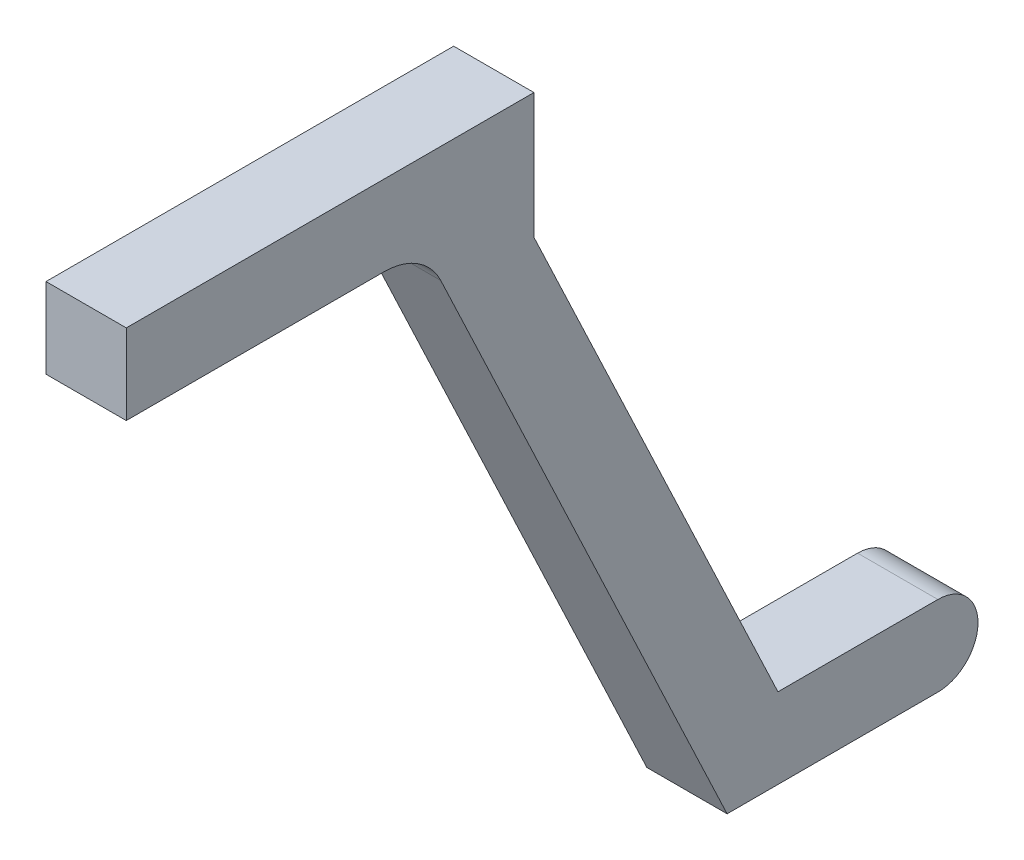
ISO-10303-21;
HEADER;
FILE_DESCRIPTION(('STEP AP214'),'2;1');
FILE_NAME('part.step','',(''),(''),'','','');
FILE_SCHEMA(('AUTOMOTIVE_DESIGN { 1 0 10303 214 1 1 1 1 }'));
ENDSEC;
DATA;
#1=APPLICATION_CONTEXT('core data for automotive mechanical design processes');
#2=APPLICATION_PROTOCOL_DEFINITION('international standard','automotive_design',2000,#1);
#3=PRODUCT_CONTEXT('',#1,'mechanical');
#4=PRODUCT('Part','Part','',(#3));
#5=PRODUCT_RELATED_PRODUCT_CATEGORY('part','',(#4));
#6=PRODUCT_DEFINITION_FORMATION('','',#4);
#7=PRODUCT_DEFINITION_CONTEXT('part definition',#1,'design');
#8=PRODUCT_DEFINITION('design','',#6,#7);
#9=PRODUCT_DEFINITION_SHAPE('','',#8);
#10=(LENGTH_UNIT() NAMED_UNIT(*) SI_UNIT(.MILLI.,.METRE.));
#11=(NAMED_UNIT(*) PLANE_ANGLE_UNIT() SI_UNIT($,.RADIAN.));
#12=(NAMED_UNIT(*) SI_UNIT($,.STERADIAN.) SOLID_ANGLE_UNIT());
#13=UNCERTAINTY_MEASURE_WITH_UNIT(LENGTH_MEASURE(1.E-05),#10,'distance_accuracy_value','');
#14=(GEOMETRIC_REPRESENTATION_CONTEXT(3) GLOBAL_UNCERTAINTY_ASSIGNED_CONTEXT((#13)) GLOBAL_UNIT_ASSIGNED_CONTEXT((#10,
#11,#12)) REPRESENTATION_CONTEXT('',''));
#15=CARTESIAN_POINT('',(0.,0.,0.));
#16=DIRECTION('',(0.,0.,1.));
#17=DIRECTION('',(1.,0.,0.));
#18=AXIS2_PLACEMENT_3D('',#15,#16,#17);
#19=CARTESIAN_POINT('',(1.18,0.,0.));
#20=DIRECTION('',(1.,0.,0.));
#21=DIRECTION('',(0.,1.,0.));
#22=AXIS2_PLACEMENT_3D('',#19,#20,#21);
#23=PLANE('',#22);
#24=DIRECTION('',(0.,0.,1.));
#25=VECTOR('',#24,1.);
#26=CARTESIAN_POINT('',(1.18,1.82,-6.905));
#27=LINE('',#26,#25);
#28=CARTESIAN_POINT('',(1.18,1.82,-6.905));
#29=VERTEX_POINT('',#28);
#30=CARTESIAN_POINT('',(1.18,1.82,-3.655));
#31=VERTEX_POINT('',#30);
#32=EDGE_CURVE('E151',#29,#31,#27,.T.);
#33=ORIENTED_EDGE('',*,*,#32,.F.);
#34=DIRECTION('',(0.,1.,0.));
#35=VECTOR('',#34,1.);
#36=CARTESIAN_POINT('',(1.18,0.82,-6.905));
#37=LINE('',#36,#35);
#38=CARTESIAN_POINT('',(1.18,0.82,-6.905));
#39=VERTEX_POINT('',#38);
#40=EDGE_CURVE('E11',#39,#29,#37,.T.);
#41=ORIENTED_EDGE('',*,*,#40,.F.);
#42=DIRECTION('',(0.,0.903880757165651,0.427784498112835));
#43=VECTOR('',#42,1.);
#44=CARTESIAN_POINT('',(1.18,-3.29,-8.850161763103));
#45=LINE('',#44,#43);
#46=CARTESIAN_POINT('',(1.18,-3.29,-8.850161763103));
#47=VERTEX_POINT('',#46);
#48=EDGE_CURVE('E44',#47,#39,#45,.T.);
#49=ORIENTED_EDGE('',*,*,#48,.F.);
#50=DIRECTION('',(0.,0.,1.));
#51=VECTOR('',#50,1.);
#52=CARTESIAN_POINT('',(1.18,-3.29,-10.125));
#53=LINE('',#52,#51);
#54=CARTESIAN_POINT('',(1.18,-3.29,-10.125));
#55=VERTEX_POINT('',#54);
#56=EDGE_CURVE('E183',#55,#47,#53,.T.);
#57=ORIENTED_EDGE('',*,*,#56,.F.);
#58=CARTESIAN_POINT('',(1.18,-3.61,-10.125));
#59=DIRECTION('',(1.,0.,0.));
#60=DIRECTION('',(0.,-1.,0.));
#61=AXIS2_PLACEMENT_3D('',#58,#59,#60);
#62=CIRCLE('',#61,0.32);
#63=CARTESIAN_POINT('',(1.18,-3.93,-10.125));
#64=VERTEX_POINT('',#63);
#65=EDGE_CURVE('E161',#64,#55,#62,.T.);
#66=ORIENTED_EDGE('',*,*,#65,.F.);
#67=DIRECTION('',(0.,0.,-1.));
#68=VECTOR('',#67,1.);
#69=CARTESIAN_POINT('',(1.18,-3.93,-8.445));
#70=LINE('',#69,#68);
#71=CARTESIAN_POINT('',(1.18,-3.93,-8.445));
#72=VERTEX_POINT('',#71);
#73=EDGE_CURVE('E173',#72,#64,#70,.T.);
#74=ORIENTED_EDGE('',*,*,#73,.F.);
#75=DIRECTION('',(0.,-0.903880757165651,-0.427784498112835));
#76=VECTOR('',#75,1.);
#77=CARTESIAN_POINT('',(1.18,0.893892249056,-6.161970619905));
#78=LINE('',#77,#76);
#79=CARTESIAN_POINT('',(1.18,0.893892249056,-6.161970619905));
#80=VERTEX_POINT('',#79);
#81=EDGE_CURVE('E124',#80,#72,#78,.T.);
#82=ORIENTED_EDGE('',*,*,#81,.F.);
#83=CARTESIAN_POINT('',(1.18,0.68,-5.710030241322));
#84=DIRECTION('',(-1.,0.,0.));
#85=DIRECTION('',(0.,1.,0.));
#86=AXIS2_PLACEMENT_3D('',#83,#84,#85);
#87=CIRCLE('',#86,0.5);
#88=CARTESIAN_POINT('',(1.18,1.18,-5.710030241322));
#89=VERTEX_POINT('',#88);
#90=EDGE_CURVE('E117',#89,#80,#87,.T.);
#91=ORIENTED_EDGE('',*,*,#90,.F.);
#92=DIRECTION('',(0.,0.,1.));
#93=VECTOR('',#92,1.);
#94=CARTESIAN_POINT('',(1.18,1.18,-4.285));
#95=LINE('',#94,#93);
#96=CARTESIAN_POINT('',(1.18,1.18,-3.655));
#97=VERTEX_POINT('',#96);
#98=EDGE_CURVE('E121',#89,#97,#95,.T.);
#99=ORIENTED_EDGE('',*,*,#98,.T.);
#100=DIRECTION('',(0.,1.,0.));
#101=VECTOR('',#100,1.);
#102=CARTESIAN_POINT('',(1.18,-0.03612426947239,-3.655));
#103=LINE('',#102,#101);
#104=EDGE_CURVE('E244',#97,#31,#103,.T.);
#105=ORIENTED_EDGE('',*,*,#104,.T.);
#106=EDGE_LOOP('',(#33,#41,#49,#57,#66,#74,#82,#91,#99,#105));
#107=FACE_BOUND('',#106,.T.);
#108=ADVANCED_FACE('F17',(#107),#23,.F.);
#109=CARTESIAN_POINT('',(1.82,0.82,-6.905));
#110=DIRECTION('',(0.,0.,-1.));
#111=DIRECTION('',(0.,-1.,0.));
#112=AXIS2_PLACEMENT_3D('',#109,#110,#111);
#113=PLANE('',#112);
#114=DIRECTION('',(0.,1.,0.));
#115=VECTOR('',#114,1.);
#116=CARTESIAN_POINT('',(1.82,0.82,-6.905));
#117=LINE('',#116,#115);
#118=CARTESIAN_POINT('',(1.82,0.82,-6.905));
#119=VERTEX_POINT('',#118);
#120=CARTESIAN_POINT('',(1.82,1.82,-6.905));
#121=VERTEX_POINT('',#120);
#122=EDGE_CURVE('E200',#119,#121,#117,.T.);
#123=ORIENTED_EDGE('',*,*,#122,.F.);
#124=DIRECTION('',(-1.,0.,0.));
#125=VECTOR('',#124,1.);
#126=CARTESIAN_POINT('',(1.82,0.82,-6.905));
#127=LINE('',#126,#125);
#128=EDGE_CURVE('E21',#119,#39,#127,.T.);
#129=ORIENTED_EDGE('',*,*,#128,.T.);
#130=ORIENTED_EDGE('',*,*,#40,.T.);
#131=DIRECTION('',(-1.,0.,0.));
#132=VECTOR('',#131,1.);
#133=CARTESIAN_POINT('',(1.82,1.82,-6.905));
#134=LINE('',#133,#132);
#135=EDGE_CURVE('E144',#121,#29,#134,.T.);
#136=ORIENTED_EDGE('',*,*,#135,.F.);
#137=EDGE_LOOP('',(#123,#129,#130,#136));
#138=FACE_BOUND('',#137,.T.);
#139=ADVANCED_FACE('F198',(#138),#113,.T.);
#140=CARTESIAN_POINT('',(1.82,-3.29,-8.850161763103));
#141=DIRECTION('',(0.,0.427784498112835,-0.903880757165651));
#142=DIRECTION('',(-1.,0.,0.));
#143=AXIS2_PLACEMENT_3D('',#140,#141,#142);
#144=PLANE('',#143);
#145=DIRECTION('',(0.,0.903880757165651,0.427784498112835));
#146=VECTOR('',#145,1.);
#147=CARTESIAN_POINT('',(1.82,-3.29,-8.850161763103));
#148=LINE('',#147,#146);
#149=CARTESIAN_POINT('',(1.82,-3.29,-8.850161763103));
#150=VERTEX_POINT('',#149);
#151=EDGE_CURVE('E204',#150,#119,#148,.T.);
#152=ORIENTED_EDGE('',*,*,#151,.F.);
#153=DIRECTION('',(-1.,0.,0.));
#154=VECTOR('',#153,1.);
#155=CARTESIAN_POINT('',(1.82,-3.29,-8.850161763103));
#156=LINE('',#155,#154);
#157=EDGE_CURVE('E187',#150,#47,#156,.T.);
#158=ORIENTED_EDGE('',*,*,#157,.T.);
#159=ORIENTED_EDGE('',*,*,#48,.T.);
#160=ORIENTED_EDGE('',*,*,#128,.F.);
#161=EDGE_LOOP('',(#152,#158,#159,#160));
#162=FACE_BOUND('',#161,.T.);
#163=ADVANCED_FACE('F203',(#162),#144,.T.);
#164=CARTESIAN_POINT('',(1.82,-3.29,-10.125));
#165=DIRECTION('',(0.,1.,0.));
#166=DIRECTION('',(1.,0.,0.));
#167=AXIS2_PLACEMENT_3D('',#164,#165,#166);
#168=PLANE('',#167);
#169=DIRECTION('',(0.,0.,1.));
#170=VECTOR('',#169,1.);
#171=CARTESIAN_POINT('',(1.82,-3.29,-10.125));
#172=LINE('',#171,#170);
#173=CARTESIAN_POINT('',(1.82,-3.29,-10.125));
#174=VERTEX_POINT('',#173);
#175=EDGE_CURVE('E208',#174,#150,#172,.T.);
#176=ORIENTED_EDGE('',*,*,#175,.F.);
#177=DIRECTION('',(-1.,0.,0.));
#178=VECTOR('',#177,1.);
#179=CARTESIAN_POINT('',(1.82,-3.29,-10.125));
#180=LINE('',#179,#178);
#181=EDGE_CURVE('E165',#174,#55,#180,.T.);
#182=ORIENTED_EDGE('',*,*,#181,.T.);
#183=ORIENTED_EDGE('',*,*,#56,.T.);
#184=ORIENTED_EDGE('',*,*,#157,.F.);
#185=EDGE_LOOP('',(#176,#182,#183,#184));
#186=FACE_BOUND('',#185,.T.);
#187=ADVANCED_FACE('F270',(#186),#168,.T.);
#188=CARTESIAN_POINT('',(1.82,-3.61,-10.125));
#189=DIRECTION('',(1.,0.,0.));
#190=DIRECTION('',(0.,0.,-1.));
#191=AXIS2_PLACEMENT_3D('',#188,#189,#190);
#192=CYLINDRICAL_SURFACE('',#191,0.32);
#193=CARTESIAN_POINT('',(1.82,-3.61,-10.125));
#194=DIRECTION('',(1.,0.,0.));
#195=DIRECTION('',(0.,-1.,0.));
#196=AXIS2_PLACEMENT_3D('',#193,#194,#195);
#197=CIRCLE('',#196,0.32);
#198=CARTESIAN_POINT('',(1.82,-3.93,-10.125));
#199=VERTEX_POINT('',#198);
#200=EDGE_CURVE('E215',#199,#174,#197,.T.);
#201=ORIENTED_EDGE('',*,*,#200,.F.);
#202=DIRECTION('',(-1.,0.,0.));
#203=VECTOR('',#202,1.);
#204=CARTESIAN_POINT('',(1.82,-3.93,-10.125));
#205=LINE('',#204,#203);
#206=EDGE_CURVE('E166',#199,#64,#205,.T.);
#207=ORIENTED_EDGE('',*,*,#206,.T.);
#208=ORIENTED_EDGE('',*,*,#65,.T.);
#209=ORIENTED_EDGE('',*,*,#181,.F.);
#210=EDGE_LOOP('',(#201,#207,#208,#209));
#211=FACE_BOUND('',#210,.T.);
#212=ADVANCED_FACE('F269',(#211),#192,.T.);
#213=CARTESIAN_POINT('',(1.82,-3.93,-8.445));
#214=DIRECTION('',(0.,-1.,0.));
#215=DIRECTION('',(0.,0.,-1.));
#216=AXIS2_PLACEMENT_3D('',#213,#214,#215);
#217=PLANE('',#216);
#218=DIRECTION('',(0.,0.,-1.));
#219=VECTOR('',#218,1.);
#220=CARTESIAN_POINT('',(1.82,-3.93,-8.445));
#221=LINE('',#220,#219);
#222=CARTESIAN_POINT('',(1.82,-3.93,-8.445));
#223=VERTEX_POINT('',#222);
#224=EDGE_CURVE('E222',#223,#199,#221,.T.);
#225=ORIENTED_EDGE('',*,*,#224,.F.);
#226=DIRECTION('',(-1.,0.,0.));
#227=VECTOR('',#226,1.);
#228=CARTESIAN_POINT('',(1.82,-3.93,-8.445));
#229=LINE('',#228,#227);
#230=EDGE_CURVE('E169',#223,#72,#229,.T.);
#231=ORIENTED_EDGE('',*,*,#230,.T.);
#232=ORIENTED_EDGE('',*,*,#73,.T.);
#233=ORIENTED_EDGE('',*,*,#206,.F.);
#234=EDGE_LOOP('',(#225,#231,#232,#233));
#235=FACE_BOUND('',#234,.T.);
#236=ADVANCED_FACE('F19',(#235),#217,.T.);
#237=CARTESIAN_POINT('',(1.82,0.893892249056,-6.161970619905));
#238=DIRECTION('',(0.,-0.427784498112835,0.903880757165651));
#239=DIRECTION('',(-1.,0.,0.));
#240=AXIS2_PLACEMENT_3D('',#237,#238,#239);
#241=PLANE('',#240);
#242=DIRECTION('',(0.,-0.903880757165651,-0.427784498112835));
#243=VECTOR('',#242,1.);
#244=CARTESIAN_POINT('',(1.82,0.893892249056,-6.161970619905));
#245=LINE('',#244,#243);
#246=CARTESIAN_POINT('',(1.82,0.893892249056,-6.161970619905));
#247=VERTEX_POINT('',#246);
#248=EDGE_CURVE('E258',#247,#223,#245,.T.);
#249=ORIENTED_EDGE('',*,*,#248,.F.);
#250=DIRECTION('',(-1.,0.,0.));
#251=VECTOR('',#250,1.);
#252=CARTESIAN_POINT('',(1.82,0.893892249056,-6.161970619905));
#253=LINE('',#252,#251);
#254=EDGE_CURVE('E128',#247,#80,#253,.T.);
#255=ORIENTED_EDGE('',*,*,#254,.T.);
#256=ORIENTED_EDGE('',*,*,#81,.T.);
#257=ORIENTED_EDGE('',*,*,#230,.F.);
#258=EDGE_LOOP('',(#249,#255,#256,#257));
#259=FACE_BOUND('',#258,.T.);
#260=ADVANCED_FACE('F292',(#259),#241,.T.);
#261=CARTESIAN_POINT('',(1.82,0.68,-5.710030241322));
#262=DIRECTION('',(1.,0.,0.));
#263=DIRECTION('',(0.,0.,-1.));
#264=AXIS2_PLACEMENT_3D('',#261,#262,#263);
#265=CYLINDRICAL_SURFACE('',#264,0.5);
#266=CARTESIAN_POINT('',(1.82,0.68,-5.710030241322));
#267=DIRECTION('',(-1.,0.,0.));
#268=DIRECTION('',(0.,1.,0.));
#269=AXIS2_PLACEMENT_3D('',#266,#267,#268);
#270=CIRCLE('',#269,0.5);
#271=CARTESIAN_POINT('',(1.82,1.18,-5.710030241322));
#272=VERTEX_POINT('',#271);
#273=EDGE_CURVE('E134',#272,#247,#270,.T.);
#274=ORIENTED_EDGE('',*,*,#273,.F.);
#275=DIRECTION('',(-1.,0.,0.));
#276=VECTOR('',#275,1.);
#277=CARTESIAN_POINT('',(1.82,1.18,-5.710030241322));
#278=LINE('',#277,#276);
#279=EDGE_CURVE('E129',#272,#89,#278,.T.);
#280=ORIENTED_EDGE('',*,*,#279,.T.);
#281=ORIENTED_EDGE('',*,*,#90,.T.);
#282=ORIENTED_EDGE('',*,*,#254,.F.);
#283=EDGE_LOOP('',(#274,#280,#281,#282));
#284=FACE_BOUND('',#283,.T.);
#285=ADVANCED_FACE('F132',(#284),#265,.F.);
#286=CARTESIAN_POINT('',(1.82,1.18,2.555));
#287=DIRECTION('',(0.,-1.,0.));
#288=DIRECTION('',(0.,0.,-1.));
#289=AXIS2_PLACEMENT_3D('',#286,#287,#288);
#290=PLANE('',#289);
#291=DIRECTION('',(0.,0.,-1.));
#292=VECTOR('',#291,1.);
#293=CARTESIAN_POINT('',(1.82,1.18,-4.285));
#294=LINE('',#293,#292);
#295=CARTESIAN_POINT('',(1.82,1.18,-3.655));
#296=VERTEX_POINT('',#295);
#297=EDGE_CURVE('E239',#296,#272,#294,.T.);
#298=ORIENTED_EDGE('',*,*,#297,.F.);
#299=DIRECTION('',(1.,0.,0.));
#300=VECTOR('',#299,1.);
#301=CARTESIAN_POINT('',(1.18,1.18,-3.655));
#302=LINE('',#301,#300);
#303=EDGE_CURVE('E141',#97,#296,#302,.T.);
#304=ORIENTED_EDGE('',*,*,#303,.F.);
#305=ORIENTED_EDGE('',*,*,#98,.F.);
#306=ORIENTED_EDGE('',*,*,#279,.F.);
#307=EDGE_LOOP('',(#298,#304,#305,#306));
#308=FACE_BOUND('',#307,.T.);
#309=ADVANCED_FACE('F139',(#308),#290,.T.);
#310=CARTESIAN_POINT('',(1.82,1.82,-6.905));
#311=DIRECTION('',(0.,1.,0.));
#312=DIRECTION('',(1.,0.,0.));
#313=AXIS2_PLACEMENT_3D('',#310,#311,#312);
#314=PLANE('',#313);
#315=ORIENTED_EDGE('',*,*,#32,.T.);
#316=DIRECTION('',(1.,0.,0.));
#317=VECTOR('',#316,1.);
#318=CARTESIAN_POINT('',(1.18,1.82,-3.655));
#319=LINE('',#318,#317);
#320=CARTESIAN_POINT('',(1.82,1.82,-3.655));
#321=VERTEX_POINT('',#320);
#322=EDGE_CURVE('E235',#31,#321,#319,.T.);
#323=ORIENTED_EDGE('',*,*,#322,.T.);
#324=DIRECTION('',(0.,0.,-1.));
#325=VECTOR('',#324,1.);
#326=CARTESIAN_POINT('',(1.82,1.82,-3.655));
#327=LINE('',#326,#325);
#328=EDGE_CURVE('E155',#321,#121,#327,.T.);
#329=ORIENTED_EDGE('',*,*,#328,.T.);
#330=ORIENTED_EDGE('',*,*,#135,.T.);
#331=EDGE_LOOP('',(#315,#323,#329,#330));
#332=FACE_BOUND('',#331,.T.);
#333=ADVANCED_FACE('F233',(#332),#314,.T.);
#334=CARTESIAN_POINT('',(1.82,0.,0.));
#335=DIRECTION('',(1.,0.,0.));
#336=DIRECTION('',(0.,1.,0.));
#337=AXIS2_PLACEMENT_3D('',#334,#335,#336);
#338=PLANE('',#337);
#339=ORIENTED_EDGE('',*,*,#297,.T.);
#340=ORIENTED_EDGE('',*,*,#273,.T.);
#341=ORIENTED_EDGE('',*,*,#248,.T.);
#342=ORIENTED_EDGE('',*,*,#224,.T.);
#343=ORIENTED_EDGE('',*,*,#200,.T.);
#344=ORIENTED_EDGE('',*,*,#175,.T.);
#345=ORIENTED_EDGE('',*,*,#151,.T.);
#346=ORIENTED_EDGE('',*,*,#122,.T.);
#347=ORIENTED_EDGE('',*,*,#328,.F.);
#348=DIRECTION('',(0.,-1.,0.));
#349=VECTOR('',#348,1.);
#350=CARTESIAN_POINT('',(1.82,1.82,-3.655));
#351=LINE('',#350,#349);
#352=EDGE_CURVE('E238',#321,#296,#351,.T.);
#353=ORIENTED_EDGE('',*,*,#352,.T.);
#354=EDGE_LOOP('',(#339,#340,#341,#342,#343,#344,#345,#346,#347,#353));
#355=FACE_BOUND('',#354,.T.);
#356=ADVANCED_FACE('F212',(#355),#338,.T.);
#357=CARTESIAN_POINT('',(1.82,1.18,-3.655));
#358=DIRECTION('',(0.,0.,1.));
#359=DIRECTION('',(1.,0.,0.));
#360=AXIS2_PLACEMENT_3D('',#357,#358,#359);
#361=PLANE('',#360);
#362=ORIENTED_EDGE('',*,*,#104,.F.);
#363=ORIENTED_EDGE('',*,*,#303,.T.);
#364=ORIENTED_EDGE('',*,*,#352,.F.);
#365=ORIENTED_EDGE('',*,*,#322,.F.);
#366=EDGE_LOOP('',(#362,#363,#364,#365));
#367=FACE_BOUND('',#366,.T.);
#368=ADVANCED_FACE('F243',(#367),#361,.T.);
#369=CLOSED_SHELL('',(#108,#139,#163,#187,#212,#236,#260,#285,#309,#333,#356,#368));
#370=MANIFOLD_SOLID_BREP('B1',#369);
#371=ADVANCED_BREP_SHAPE_REPRESENTATION('',(#18,#370),#14);
#372=SHAPE_DEFINITION_REPRESENTATION(#9,#371);
ENDSEC;
END-ISO-10303-21;
